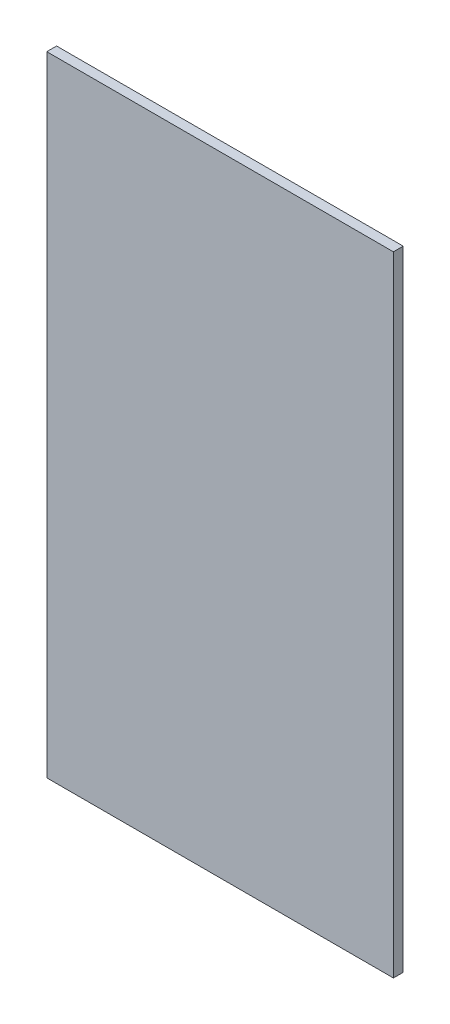
ISO-10303-21;
HEADER;
FILE_DESCRIPTION(('STEP AP214'),'2;1');
FILE_NAME('part.step','',(''),(''),'','','');
FILE_SCHEMA(('AUTOMOTIVE_DESIGN { 1 0 10303 214 1 1 1 1 }'));
ENDSEC;
DATA;
#1=APPLICATION_CONTEXT('core data for automotive mechanical design processes');
#2=APPLICATION_PROTOCOL_DEFINITION('international standard','automotive_design',2000,#1);
#3=PRODUCT_CONTEXT('',#1,'mechanical');
#4=PRODUCT('Part','Part','',(#3));
#5=PRODUCT_RELATED_PRODUCT_CATEGORY('part','',(#4));
#6=PRODUCT_DEFINITION_FORMATION('','',#4);
#7=PRODUCT_DEFINITION_CONTEXT('part definition',#1,'design');
#8=PRODUCT_DEFINITION('design','',#6,#7);
#9=PRODUCT_DEFINITION_SHAPE('','',#8);
#10=(LENGTH_UNIT() NAMED_UNIT(*) SI_UNIT(.MILLI.,.METRE.));
#11=(NAMED_UNIT(*) PLANE_ANGLE_UNIT() SI_UNIT($,.RADIAN.));
#12=(NAMED_UNIT(*) SI_UNIT($,.STERADIAN.) SOLID_ANGLE_UNIT());
#13=UNCERTAINTY_MEASURE_WITH_UNIT(LENGTH_MEASURE(1.E-05),#10,'distance_accuracy_value','');
#14=(GEOMETRIC_REPRESENTATION_CONTEXT(3) GLOBAL_UNCERTAINTY_ASSIGNED_CONTEXT((#13)) GLOBAL_UNIT_ASSIGNED_CONTEXT((#10,
#11,#12)) REPRESENTATION_CONTEXT('',''));
#15=CARTESIAN_POINT('',(0.,0.,0.));
#16=DIRECTION('',(0.,0.,1.));
#17=DIRECTION('',(1.,0.,0.));
#18=AXIS2_PLACEMENT_3D('',#15,#16,#17);
#19=CARTESIAN_POINT('',(-43.2327780129988,-162.420254237723,3.175));
#20=DIRECTION('',(1.,0.,0.));
#21=DIRECTION('',(0.,0.,-1.));
#22=AXIS2_PLACEMENT_3D('',#19,#20,#21);
#23=PLANE('',#22);
#24=DIRECTION('',(0.,-1.,0.));
#25=VECTOR('',#24,1.);
#26=CARTESIAN_POINT('',(-43.2327780129988,-162.420254237723,0.));
#27=LINE('',#26,#25);
#28=CARTESIAN_POINT('',(-43.2327780129988,40.779745762277,0.));
#29=VERTEX_POINT('',#28);
#30=CARTESIAN_POINT('',(-43.2327780129988,-162.420254237723,0.));
#31=VERTEX_POINT('',#30);
#32=EDGE_CURVE('E96',#29,#31,#27,.T.);
#33=ORIENTED_EDGE('',*,*,#32,.T.);
#34=DIRECTION('',(0.,0.,-1.));
#35=VECTOR('',#34,1.);
#36=CARTESIAN_POINT('',(-43.2327780129988,-162.420254237723,3.175));
#37=LINE('',#36,#35);
#38=CARTESIAN_POINT('',(-43.2327780129988,-162.420254237723,3.175));
#39=VERTEX_POINT('',#38);
#40=EDGE_CURVE('E11',#39,#31,#37,.T.);
#41=ORIENTED_EDGE('',*,*,#40,.F.);
#42=DIRECTION('',(0.,-1.,0.));
#43=VECTOR('',#42,1.);
#44=CARTESIAN_POINT('',(-43.2327780129988,-162.420254237723,3.175));
#45=LINE('',#44,#43);
#46=CARTESIAN_POINT('',(-43.2327780129988,40.779745762277,3.175));
#47=VERTEX_POINT('',#46);
#48=EDGE_CURVE('E84',#47,#39,#45,.T.);
#49=ORIENTED_EDGE('',*,*,#48,.F.);
#50=DIRECTION('',(0.,0.,-1.));
#51=VECTOR('',#50,1.);
#52=CARTESIAN_POINT('',(-43.2327780129988,40.779745762277,3.175));
#53=LINE('',#52,#51);
#54=EDGE_CURVE('E92',#47,#29,#53,.T.);
#55=ORIENTED_EDGE('',*,*,#54,.T.);
#56=EDGE_LOOP('',(#33,#41,#49,#55));
#57=FACE_BOUND('',#56,.T.);
#58=ADVANCED_FACE('F33',(#57),#23,.F.);
#59=CARTESIAN_POINT('',(-43.2327780129988,-162.420254237723,3.175));
#60=DIRECTION('',(0.,1.,0.));
#61=DIRECTION('',(-1.,0.,0.));
#62=AXIS2_PLACEMENT_3D('',#59,#60,#61);
#63=PLANE('',#62);
#64=DIRECTION('',(1.,0.,0.));
#65=VECTOR('',#64,1.);
#66=CARTESIAN_POINT('',(-43.2327780129988,-162.420254237723,0.));
#67=LINE('',#66,#65);
#68=CARTESIAN_POINT('',(68.7672219870012,-162.420254237723,0.));
#69=VERTEX_POINT('',#68);
#70=EDGE_CURVE('E88',#31,#69,#67,.T.);
#71=ORIENTED_EDGE('',*,*,#70,.T.);
#72=DIRECTION('',(0.,0.,-1.));
#73=VECTOR('',#72,1.);
#74=CARTESIAN_POINT('',(68.7672219870012,-162.420254237723,3.175));
#75=LINE('',#74,#73);
#76=CARTESIAN_POINT('',(68.7672219870012,-162.420254237723,3.175));
#77=VERTEX_POINT('',#76);
#78=EDGE_CURVE('E41',#77,#69,#75,.T.);
#79=ORIENTED_EDGE('',*,*,#78,.F.);
#80=DIRECTION('',(1.,0.,0.));
#81=VECTOR('',#80,1.);
#82=CARTESIAN_POINT('',(-43.2327780129988,-162.420254237723,3.175));
#83=LINE('',#82,#81);
#84=EDGE_CURVE('E79',#39,#77,#83,.T.);
#85=ORIENTED_EDGE('',*,*,#84,.F.);
#86=ORIENTED_EDGE('',*,*,#40,.T.);
#87=EDGE_LOOP('',(#71,#79,#85,#86));
#88=FACE_BOUND('',#87,.T.);
#89=ADVANCED_FACE('F87',(#88),#63,.F.);
#90=CARTESIAN_POINT('',(68.7672219870012,-162.420254237723,3.175));
#91=DIRECTION('',(-1.,0.,0.));
#92=DIRECTION('',(0.,0.,1.));
#93=AXIS2_PLACEMENT_3D('',#90,#91,#92);
#94=PLANE('',#93);
#95=DIRECTION('',(0.,1.,0.));
#96=VECTOR('',#95,1.);
#97=CARTESIAN_POINT('',(68.7672219870012,-162.420254237723,0.));
#98=LINE('',#97,#96);
#99=CARTESIAN_POINT('',(68.7672219870012,40.779745762277,0.));
#100=VERTEX_POINT('',#99);
#101=EDGE_CURVE('E66',#69,#100,#98,.T.);
#102=ORIENTED_EDGE('',*,*,#101,.T.);
#103=DIRECTION('',(0.,0.,-1.));
#104=VECTOR('',#103,1.);
#105=CARTESIAN_POINT('',(68.7672219870012,40.779745762277,3.175));
#106=LINE('',#105,#104);
#107=CARTESIAN_POINT('',(68.7672219870012,40.779745762277,3.175));
#108=VERTEX_POINT('',#107);
#109=EDGE_CURVE('E89',#108,#100,#106,.T.);
#110=ORIENTED_EDGE('',*,*,#109,.F.);
#111=DIRECTION('',(0.,1.,0.));
#112=VECTOR('',#111,1.);
#113=CARTESIAN_POINT('',(68.7672219870012,-162.420254237723,3.175));
#114=LINE('',#113,#112);
#115=EDGE_CURVE('E82',#77,#108,#114,.T.);
#116=ORIENTED_EDGE('',*,*,#115,.F.);
#117=ORIENTED_EDGE('',*,*,#78,.T.);
#118=EDGE_LOOP('',(#102,#110,#116,#117));
#119=FACE_BOUND('',#118,.T.);
#120=ADVANCED_FACE('F90',(#119),#94,.F.);
#121=CARTESIAN_POINT('',(-43.2327780129988,40.779745762277,3.175));
#122=DIRECTION('',(0.,-1.,0.));
#123=DIRECTION('',(0.,0.,-1.));
#124=AXIS2_PLACEMENT_3D('',#121,#122,#123);
#125=PLANE('',#124);
#126=DIRECTION('',(-1.,0.,0.));
#127=VECTOR('',#126,1.);
#128=CARTESIAN_POINT('',(-43.2327780129988,40.779745762277,0.));
#129=LINE('',#128,#127);
#130=EDGE_CURVE('E72',#100,#29,#129,.T.);
#131=ORIENTED_EDGE('',*,*,#130,.T.);
#132=ORIENTED_EDGE('',*,*,#54,.F.);
#133=DIRECTION('',(-1.,0.,0.));
#134=VECTOR('',#133,1.);
#135=CARTESIAN_POINT('',(-43.2327780129988,40.779745762277,3.175));
#136=LINE('',#135,#134);
#137=EDGE_CURVE('E49',#108,#47,#136,.T.);
#138=ORIENTED_EDGE('',*,*,#137,.F.);
#139=ORIENTED_EDGE('',*,*,#109,.T.);
#140=EDGE_LOOP('',(#131,#132,#138,#139));
#141=FACE_BOUND('',#140,.T.);
#142=ADVANCED_FACE('F103',(#141),#125,.F.);
#143=CARTESIAN_POINT('',(0.,0.,3.175));
#144=DIRECTION('',(0.,0.,-1.));
#145=DIRECTION('',(-1.,0.,0.));
#146=AXIS2_PLACEMENT_3D('',#143,#144,#145);
#147=PLANE('',#146);
#148=ORIENTED_EDGE('',*,*,#48,.T.);
#149=ORIENTED_EDGE('',*,*,#84,.T.);
#150=ORIENTED_EDGE('',*,*,#115,.T.);
#151=ORIENTED_EDGE('',*,*,#137,.T.);
#152=EDGE_LOOP('',(#148,#149,#150,#151));
#153=FACE_BOUND('',#152,.T.);
#154=ADVANCED_FACE('F80',(#153),#147,.F.);
#155=CARTESIAN_POINT('',(0.,0.,0.));
#156=DIRECTION('',(0.,0.,-1.));
#157=DIRECTION('',(-1.,0.,0.));
#158=AXIS2_PLACEMENT_3D('',#155,#156,#157);
#159=PLANE('',#158);
#160=ORIENTED_EDGE('',*,*,#32,.F.);
#161=ORIENTED_EDGE('',*,*,#130,.F.);
#162=ORIENTED_EDGE('',*,*,#101,.F.);
#163=ORIENTED_EDGE('',*,*,#70,.F.);
#164=EDGE_LOOP('',(#160,#161,#162,#163));
#165=FACE_BOUND('',#164,.T.);
#166=ADVANCED_FACE('F106',(#165),#159,.T.);
#167=CLOSED_SHELL('',(#58,#89,#120,#142,#154,#166));
#168=MANIFOLD_SOLID_BREP('B2',#167);
#169=ADVANCED_BREP_SHAPE_REPRESENTATION('',(#18,#168),#14);
#170=SHAPE_DEFINITION_REPRESENTATION(#9,#169);
ENDSEC;
END-ISO-10303-21;
